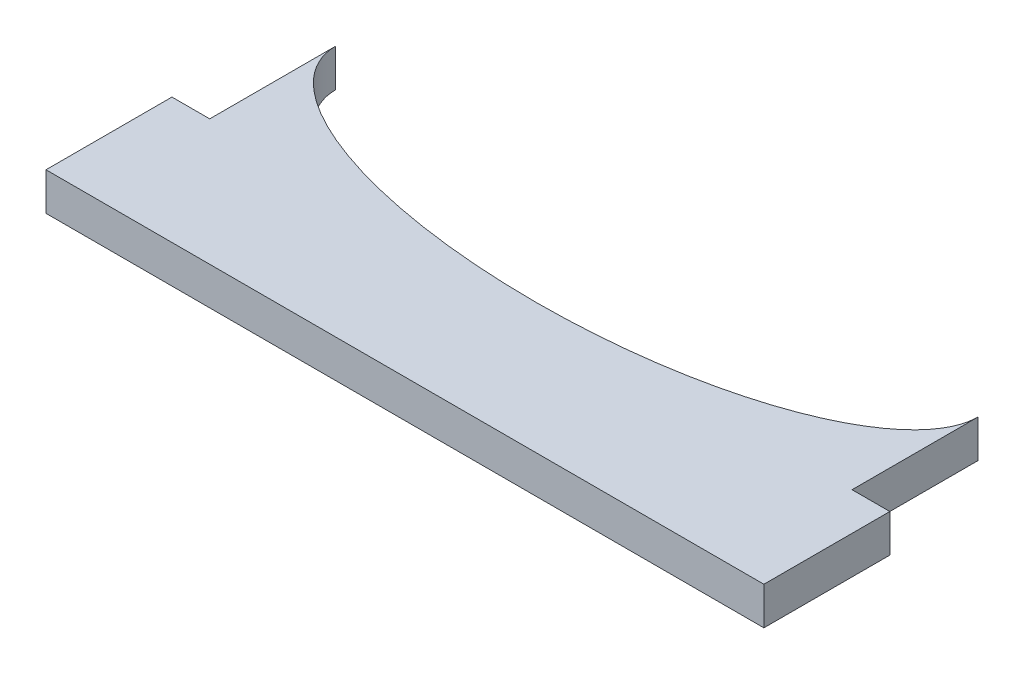
ISO-10303-21;
HEADER;
FILE_DESCRIPTION(('STEP AP214'),'2;1');
FILE_NAME('part.step','',(''),(''),'','','');
FILE_SCHEMA(('AUTOMOTIVE_DESIGN { 1 0 10303 214 1 1 1 1 }'));
ENDSEC;
DATA;
#1=APPLICATION_CONTEXT('core data for automotive mechanical design processes');
#2=APPLICATION_PROTOCOL_DEFINITION('international standard','automotive_design',2000,#1);
#3=PRODUCT_CONTEXT('',#1,'mechanical');
#4=PRODUCT('Part','Part','',(#3));
#5=PRODUCT_RELATED_PRODUCT_CATEGORY('part','',(#4));
#6=PRODUCT_DEFINITION_FORMATION('','',#4);
#7=PRODUCT_DEFINITION_CONTEXT('part definition',#1,'design');
#8=PRODUCT_DEFINITION('design','',#6,#7);
#9=PRODUCT_DEFINITION_SHAPE('','',#8);
#10=(LENGTH_UNIT() NAMED_UNIT(*) SI_UNIT(.MILLI.,.METRE.));
#11=(NAMED_UNIT(*) PLANE_ANGLE_UNIT() SI_UNIT($,.RADIAN.));
#12=(NAMED_UNIT(*) SI_UNIT($,.STERADIAN.) SOLID_ANGLE_UNIT());
#13=UNCERTAINTY_MEASURE_WITH_UNIT(LENGTH_MEASURE(1.E-05),#10,'distance_accuracy_value','');
#14=(GEOMETRIC_REPRESENTATION_CONTEXT(3) GLOBAL_UNCERTAINTY_ASSIGNED_CONTEXT((#13)) GLOBAL_UNIT_ASSIGNED_CONTEXT((#10,
#11,#12)) REPRESENTATION_CONTEXT('',''));
#15=CARTESIAN_POINT('',(0.,0.,0.));
#16=DIRECTION('',(0.,0.,1.));
#17=DIRECTION('',(1.,0.,0.));
#18=AXIS2_PLACEMENT_3D('',#15,#16,#17);
#19=CARTESIAN_POINT('',(25.5,3.,-20.));
#20=DIRECTION('',(0.,1.,0.));
#21=DIRECTION('',(1.,0.,0.));
#22=AXIS2_PLACEMENT_3D('',#19,#20,#21);
#23=ELLIPSE('',#22,25.5,9.66347013535973);
#24=DIRECTION('',(0.,-1.,0.));
#25=VECTOR('',#24,1.);
#26=SURFACE_OF_LINEAR_EXTRUSION('',#23,#25);
#27=CARTESIAN_POINT('',(25.5,0.,-20.));
#28=DIRECTION('',(0.,1.,0.));
#29=DIRECTION('',(1.,0.,0.));
#30=AXIS2_PLACEMENT_3D('',#27,#28,#29);
#31=ELLIPSE('',#30,25.5,9.66347013535973);
#32=CARTESIAN_POINT('',(0.,0.,-20.));
#33=VERTEX_POINT('',#32);
#34=CARTESIAN_POINT('',(51.,0.,-20.));
#35=VERTEX_POINT('',#34);
#36=EDGE_CURVE('E139',#33,#35,#31,.T.);
#37=ORIENTED_EDGE('',*,*,#36,.F.);
#38=DIRECTION('',(0.,-1.,0.));
#39=VECTOR('',#38,1.);
#40=CARTESIAN_POINT('',(0.,3.,-20.));
#41=LINE('',#40,#39);
#42=CARTESIAN_POINT('',(0.,3.,-20.));
#43=VERTEX_POINT('',#42);
#44=EDGE_CURVE('E11',#43,#33,#41,.T.);
#45=ORIENTED_EDGE('',*,*,#44,.F.);
#46=CARTESIAN_POINT('',(51.,3.,-20.));
#47=VERTEX_POINT('',#46);
#48=EDGE_CURVE('E166',#43,#47,#23,.T.);
#49=ORIENTED_EDGE('',*,*,#48,.T.);
#50=DIRECTION('',(0.,-1.,0.));
#51=VECTOR('',#50,1.);
#52=CARTESIAN_POINT('',(51.,3.,-20.));
#53=LINE('',#52,#51);
#54=EDGE_CURVE('E93',#47,#35,#53,.T.);
#55=ORIENTED_EDGE('',*,*,#54,.T.);
#56=EDGE_LOOP('',(#37,#45,#49,#55));
#57=FACE_BOUND('',#56,.T.);
#58=ADVANCED_FACE('F41',(#57),#26,.T.);
#59=CARTESIAN_POINT('',(0.,3.,0.));
#60=DIRECTION('',(-1.,0.,0.));
#61=DIRECTION('',(0.,0.,1.));
#62=AXIS2_PLACEMENT_3D('',#59,#60,#61);
#63=PLANE('',#62);
#64=DIRECTION('',(0.,0.,-1.));
#65=VECTOR('',#64,1.);
#66=CARTESIAN_POINT('',(0.,0.,0.));
#67=LINE('',#66,#65);
#68=CARTESIAN_POINT('',(0.,0.,-10.));
#69=VERTEX_POINT('',#68);
#70=EDGE_CURVE('E143',#69,#33,#67,.T.);
#71=ORIENTED_EDGE('',*,*,#70,.F.);
#72=DIRECTION('',(0.,-1.,0.));
#73=VECTOR('',#72,1.);
#74=CARTESIAN_POINT('',(0.,3.,-10.));
#75=LINE('',#74,#73);
#76=CARTESIAN_POINT('',(0.,3.,-10.));
#77=VERTEX_POINT('',#76);
#78=EDGE_CURVE('E51',#77,#69,#75,.T.);
#79=ORIENTED_EDGE('',*,*,#78,.F.);
#80=DIRECTION('',(0.,0.,-1.));
#81=VECTOR('',#80,1.);
#82=CARTESIAN_POINT('',(0.,3.,0.));
#83=LINE('',#82,#81);
#84=EDGE_CURVE('E194',#77,#43,#83,.T.);
#85=ORIENTED_EDGE('',*,*,#84,.T.);
#86=ORIENTED_EDGE('',*,*,#44,.T.);
#87=EDGE_LOOP('',(#71,#79,#85,#86));
#88=FACE_BOUND('',#87,.T.);
#89=ADVANCED_FACE('F193',(#88),#63,.T.);
#90=CARTESIAN_POINT('',(0.,3.,-10.));
#91=DIRECTION('',(0.,0.,1.));
#92=DIRECTION('',(1.,0.,0.));
#93=AXIS2_PLACEMENT_3D('',#90,#91,#92);
#94=PLANE('',#93);
#95=DIRECTION('',(-1.,0.,0.));
#96=VECTOR('',#95,1.);
#97=CARTESIAN_POINT('',(0.,0.,-10.));
#98=LINE('',#97,#96);
#99=CARTESIAN_POINT('',(-3.,0.,-10.));
#100=VERTEX_POINT('',#99);
#101=EDGE_CURVE('E147',#69,#100,#98,.T.);
#102=ORIENTED_EDGE('',*,*,#101,.T.);
#103=DIRECTION('',(0.,-1.,0.));
#104=VECTOR('',#103,1.);
#105=CARTESIAN_POINT('',(-3.,3.,-10.));
#106=LINE('',#105,#104);
#107=CARTESIAN_POINT('',(-3.,3.,-10.));
#108=VERTEX_POINT('',#107);
#109=EDGE_CURVE('E176',#108,#100,#106,.T.);
#110=ORIENTED_EDGE('',*,*,#109,.F.);
#111=DIRECTION('',(-1.,0.,0.));
#112=VECTOR('',#111,1.);
#113=CARTESIAN_POINT('',(0.,3.,-10.));
#114=LINE('',#113,#112);
#115=EDGE_CURVE('E185',#77,#108,#114,.T.);
#116=ORIENTED_EDGE('',*,*,#115,.F.);
#117=ORIENTED_EDGE('',*,*,#78,.T.);
#118=EDGE_LOOP('',(#102,#110,#116,#117));
#119=FACE_BOUND('',#118,.T.);
#120=ADVANCED_FACE('F183',(#119),#94,.F.);
#121=CARTESIAN_POINT('',(-3.,3.,0.));
#122=DIRECTION('',(1.,0.,0.));
#123=DIRECTION('',(0.,0.,-1.));
#124=AXIS2_PLACEMENT_3D('',#121,#122,#123);
#125=PLANE('',#124);
#126=DIRECTION('',(0.,0.,1.));
#127=VECTOR('',#126,1.);
#128=CARTESIAN_POINT('',(-3.,0.,0.));
#129=LINE('',#128,#127);
#130=CARTESIAN_POINT('',(-3.,0.,0.));
#131=VERTEX_POINT('',#130);
#132=EDGE_CURVE('E150',#100,#131,#129,.T.);
#133=ORIENTED_EDGE('',*,*,#132,.T.);
#134=DIRECTION('',(0.,-1.,0.));
#135=VECTOR('',#134,1.);
#136=CARTESIAN_POINT('',(-3.,3.,0.));
#137=LINE('',#136,#135);
#138=CARTESIAN_POINT('',(-3.,3.,0.));
#139=VERTEX_POINT('',#138);
#140=EDGE_CURVE('E173',#139,#131,#137,.T.);
#141=ORIENTED_EDGE('',*,*,#140,.F.);
#142=DIRECTION('',(0.,0.,1.));
#143=VECTOR('',#142,1.);
#144=CARTESIAN_POINT('',(-3.,3.,0.));
#145=LINE('',#144,#143);
#146=EDGE_CURVE('E203',#108,#139,#145,.T.);
#147=ORIENTED_EDGE('',*,*,#146,.F.);
#148=ORIENTED_EDGE('',*,*,#109,.T.);
#149=EDGE_LOOP('',(#133,#141,#147,#148));
#150=FACE_BOUND('',#149,.T.);
#151=ADVANCED_FACE('F212',(#150),#125,.F.);
#152=CARTESIAN_POINT('',(0.,3.,0.));
#153=DIRECTION('',(0.,0.,1.));
#154=DIRECTION('',(1.,0.,0.));
#155=AXIS2_PLACEMENT_3D('',#152,#153,#154);
#156=PLANE('',#155);
#157=DIRECTION('',(-1.,0.,0.));
#158=VECTOR('',#157,1.);
#159=CARTESIAN_POINT('',(0.,0.,0.));
#160=LINE('',#159,#158);
#161=CARTESIAN_POINT('',(54.,0.,0.));
#162=VERTEX_POINT('',#161);
#163=EDGE_CURVE('E154',#162,#131,#160,.T.);
#164=ORIENTED_EDGE('',*,*,#163,.F.);
#165=DIRECTION('',(0.,-1.,0.));
#166=VECTOR('',#165,1.);
#167=CARTESIAN_POINT('',(54.,3.,0.));
#168=LINE('',#167,#166);
#169=CARTESIAN_POINT('',(54.,3.,0.));
#170=VERTEX_POINT('',#169);
#171=EDGE_CURVE('E123',#170,#162,#168,.T.);
#172=ORIENTED_EDGE('',*,*,#171,.F.);
#173=DIRECTION('',(-1.,0.,0.));
#174=VECTOR('',#173,1.);
#175=CARTESIAN_POINT('',(0.,3.,0.));
#176=LINE('',#175,#174);
#177=EDGE_CURVE('E129',#170,#139,#176,.T.);
#178=ORIENTED_EDGE('',*,*,#177,.T.);
#179=ORIENTED_EDGE('',*,*,#140,.T.);
#180=EDGE_LOOP('',(#164,#172,#178,#179));
#181=FACE_BOUND('',#180,.T.);
#182=ADVANCED_FACE('F208',(#181),#156,.T.);
#183=CARTESIAN_POINT('',(54.,3.,0.));
#184=DIRECTION('',(1.,0.,0.));
#185=DIRECTION('',(0.,0.,-1.));
#186=AXIS2_PLACEMENT_3D('',#183,#184,#185);
#187=PLANE('',#186);
#188=DIRECTION('',(0.,0.,1.));
#189=VECTOR('',#188,1.);
#190=CARTESIAN_POINT('',(54.,0.,0.));
#191=LINE('',#190,#189);
#192=CARTESIAN_POINT('',(54.,0.,-10.));
#193=VERTEX_POINT('',#192);
#194=EDGE_CURVE('E117',#193,#162,#191,.T.);
#195=ORIENTED_EDGE('',*,*,#194,.F.);
#196=DIRECTION('',(0.,-1.,0.));
#197=VECTOR('',#196,1.);
#198=CARTESIAN_POINT('',(54.,3.,-10.));
#199=LINE('',#198,#197);
#200=CARTESIAN_POINT('',(54.,3.,-10.));
#201=VERTEX_POINT('',#200);
#202=EDGE_CURVE('E112',#201,#193,#199,.T.);
#203=ORIENTED_EDGE('',*,*,#202,.F.);
#204=DIRECTION('',(0.,0.,1.));
#205=VECTOR('',#204,1.);
#206=CARTESIAN_POINT('',(54.,3.,0.));
#207=LINE('',#206,#205);
#208=EDGE_CURVE('E115',#201,#170,#207,.T.);
#209=ORIENTED_EDGE('',*,*,#208,.T.);
#210=ORIENTED_EDGE('',*,*,#171,.T.);
#211=EDGE_LOOP('',(#195,#203,#209,#210));
#212=FACE_BOUND('',#211,.T.);
#213=ADVANCED_FACE('F114',(#212),#187,.T.);
#214=CARTESIAN_POINT('',(0.,3.,-10.));
#215=DIRECTION('',(0.,0.,-1.));
#216=DIRECTION('',(-1.,0.,0.));
#217=AXIS2_PLACEMENT_3D('',#214,#215,#216);
#218=PLANE('',#217);
#219=DIRECTION('',(1.,0.,0.));
#220=VECTOR('',#219,1.);
#221=CARTESIAN_POINT('',(0.,0.,-10.));
#222=LINE('',#221,#220);
#223=CARTESIAN_POINT('',(51.,0.,-10.));
#224=VERTEX_POINT('',#223);
#225=EDGE_CURVE('E160',#224,#193,#222,.T.);
#226=ORIENTED_EDGE('',*,*,#225,.F.);
#227=DIRECTION('',(0.,-1.,0.));
#228=VECTOR('',#227,1.);
#229=CARTESIAN_POINT('',(51.,3.,-10.));
#230=LINE('',#229,#228);
#231=CARTESIAN_POINT('',(51.,3.,-10.));
#232=VERTEX_POINT('',#231);
#233=EDGE_CURVE('E86',#232,#224,#230,.T.);
#234=ORIENTED_EDGE('',*,*,#233,.F.);
#235=DIRECTION('',(1.,0.,0.));
#236=VECTOR('',#235,1.);
#237=CARTESIAN_POINT('',(0.,3.,-10.));
#238=LINE('',#237,#236);
#239=EDGE_CURVE('E127',#232,#201,#238,.T.);
#240=ORIENTED_EDGE('',*,*,#239,.T.);
#241=ORIENTED_EDGE('',*,*,#202,.T.);
#242=EDGE_LOOP('',(#226,#234,#240,#241));
#243=FACE_BOUND('',#242,.T.);
#244=ADVANCED_FACE('F132',(#243),#218,.T.);
#245=CARTESIAN_POINT('',(51.,3.,0.));
#246=DIRECTION('',(-1.,0.,0.));
#247=DIRECTION('',(0.,0.,1.));
#248=AXIS2_PLACEMENT_3D('',#245,#246,#247);
#249=PLANE('',#248);
#250=DIRECTION('',(0.,0.,-1.));
#251=VECTOR('',#250,1.);
#252=CARTESIAN_POINT('',(51.,0.,0.));
#253=LINE('',#252,#251);
#254=EDGE_CURVE('E163',#224,#35,#253,.T.);
#255=ORIENTED_EDGE('',*,*,#254,.T.);
#256=ORIENTED_EDGE('',*,*,#54,.F.);
#257=DIRECTION('',(0.,0.,-1.));
#258=VECTOR('',#257,1.);
#259=CARTESIAN_POINT('',(51.,3.,0.));
#260=LINE('',#259,#258);
#261=EDGE_CURVE('E59',#232,#47,#260,.T.);
#262=ORIENTED_EDGE('',*,*,#261,.F.);
#263=ORIENTED_EDGE('',*,*,#233,.T.);
#264=EDGE_LOOP('',(#255,#256,#262,#263));
#265=FACE_BOUND('',#264,.T.);
#266=ADVANCED_FACE('F195',(#265),#249,.F.);
#267=CARTESIAN_POINT('',(0.,3.,0.));
#268=DIRECTION('',(0.,1.,0.));
#269=DIRECTION('',(0.,0.,1.));
#270=AXIS2_PLACEMENT_3D('',#267,#268,#269);
#271=PLANE('',#270);
#272=ORIENTED_EDGE('',*,*,#48,.F.);
#273=ORIENTED_EDGE('',*,*,#84,.F.);
#274=ORIENTED_EDGE('',*,*,#115,.T.);
#275=ORIENTED_EDGE('',*,*,#146,.T.);
#276=ORIENTED_EDGE('',*,*,#177,.F.);
#277=ORIENTED_EDGE('',*,*,#208,.F.);
#278=ORIENTED_EDGE('',*,*,#239,.F.);
#279=ORIENTED_EDGE('',*,*,#261,.T.);
#280=EDGE_LOOP('',(#272,#273,#274,#275,#276,#277,#278,#279));
#281=FACE_BOUND('',#280,.T.);
#282=ADVANCED_FACE('F126',(#281),#271,.T.);
#283=CARTESIAN_POINT('',(0.,0.,0.));
#284=DIRECTION('',(0.,1.,0.));
#285=DIRECTION('',(0.,0.,1.));
#286=AXIS2_PLACEMENT_3D('',#283,#284,#285);
#287=PLANE('',#286);
#288=ORIENTED_EDGE('',*,*,#36,.T.);
#289=ORIENTED_EDGE('',*,*,#254,.F.);
#290=ORIENTED_EDGE('',*,*,#225,.T.);
#291=ORIENTED_EDGE('',*,*,#194,.T.);
#292=ORIENTED_EDGE('',*,*,#163,.T.);
#293=ORIENTED_EDGE('',*,*,#132,.F.);
#294=ORIENTED_EDGE('',*,*,#101,.F.);
#295=ORIENTED_EDGE('',*,*,#70,.T.);
#296=EDGE_LOOP('',(#288,#289,#290,#291,#292,#293,#294,#295));
#297=FACE_BOUND('',#296,.T.);
#298=ADVANCED_FACE('F192',(#297),#287,.F.);
#299=CLOSED_SHELL('',(#58,#89,#120,#151,#182,#213,#244,#266,#282,#298));
#300=MANIFOLD_SOLID_BREP('B2',#299);
#301=ADVANCED_BREP_SHAPE_REPRESENTATION('',(#18,#300),#14);
#302=SHAPE_DEFINITION_REPRESENTATION(#9,#301);
ENDSEC;
END-ISO-10303-21;
